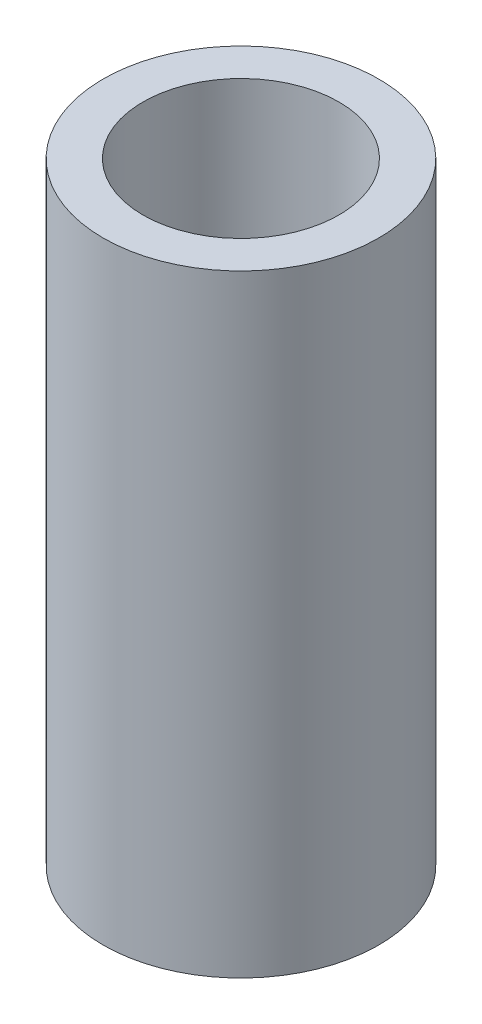
ISO-10303-21;
HEADER;
FILE_DESCRIPTION(('STEP AP214'),'2;1');
FILE_NAME('part.step','',(''),(''),'','','');
FILE_SCHEMA(('AUTOMOTIVE_DESIGN { 1 0 10303 214 1 1 1 1 }'));
ENDSEC;
DATA;
#1=APPLICATION_CONTEXT('core data for automotive mechanical design processes');
#2=APPLICATION_PROTOCOL_DEFINITION('international standard','automotive_design',2000,#1);
#3=PRODUCT_CONTEXT('',#1,'mechanical');
#4=PRODUCT('Part','Part','',(#3));
#5=PRODUCT_RELATED_PRODUCT_CATEGORY('part','',(#4));
#6=PRODUCT_DEFINITION_FORMATION('','',#4);
#7=PRODUCT_DEFINITION_CONTEXT('part definition',#1,'design');
#8=PRODUCT_DEFINITION('design','',#6,#7);
#9=PRODUCT_DEFINITION_SHAPE('','',#8);
#10=(LENGTH_UNIT() NAMED_UNIT(*) SI_UNIT(.MILLI.,.METRE.));
#11=(NAMED_UNIT(*) PLANE_ANGLE_UNIT() SI_UNIT($,.RADIAN.));
#12=(NAMED_UNIT(*) SI_UNIT($,.STERADIAN.) SOLID_ANGLE_UNIT());
#13=UNCERTAINTY_MEASURE_WITH_UNIT(LENGTH_MEASURE(1.E-05),#10,'distance_accuracy_value','');
#14=(GEOMETRIC_REPRESENTATION_CONTEXT(3) GLOBAL_UNCERTAINTY_ASSIGNED_CONTEXT((#13)) GLOBAL_UNIT_ASSIGNED_CONTEXT((#10,
#11,#12)) REPRESENTATION_CONTEXT('',''));
#15=CARTESIAN_POINT('',(0.,0.,0.));
#16=DIRECTION('',(0.,0.,1.));
#17=DIRECTION('',(1.,0.,0.));
#18=AXIS2_PLACEMENT_3D('',#15,#16,#17);
#19=CARTESIAN_POINT('',(0.,10.,0.));
#20=DIRECTION('',(0.,1.,0.));
#21=DIRECTION('',(0.,0.,1.));
#22=AXIS2_PLACEMENT_3D('',#19,#20,#21);
#23=PLANE('',#22);
#24=CARTESIAN_POINT('',(0.,10.,0.));
#25=DIRECTION('',(0.,1.,0.));
#26=DIRECTION('',(0.,0.,1.));
#27=AXIS2_PLACEMENT_3D('',#24,#25,#26);
#28=CIRCLE('',#27,2.25);
#29=CARTESIAN_POINT('',(0.,10.,2.25));
#30=VERTEX_POINT('',#29);
#31=EDGE_CURVE('E10',#30,#30,#28,.T.);
#32=ORIENTED_EDGE('',*,*,#31,.T.);
#33=EDGE_LOOP('',(#32));
#34=FACE_BOUND('',#33,.T.);
#35=CARTESIAN_POINT('',(0.,10.,0.));
#36=DIRECTION('',(0.,1.,0.));
#37=DIRECTION('',(0.,0.,1.));
#38=AXIS2_PLACEMENT_3D('',#35,#36,#37);
#39=CIRCLE('',#38,1.6);
#40=CARTESIAN_POINT('',(0.,10.,1.6));
#41=VERTEX_POINT('',#40);
#42=EDGE_CURVE('E42',#41,#41,#39,.T.);
#43=ORIENTED_EDGE('',*,*,#42,.F.);
#44=EDGE_LOOP('',(#43));
#45=FACE_BOUND('',#44,.T.);
#46=ADVANCED_FACE('F31',(#34,#45),#23,.T.);
#47=CARTESIAN_POINT('',(0.,0.,0.));
#48=DIRECTION('',(0.,1.,0.));
#49=DIRECTION('',(0.,0.,1.));
#50=AXIS2_PLACEMENT_3D('',#47,#48,#49);
#51=PLANE('',#50);
#52=CARTESIAN_POINT('',(0.,0.,0.));
#53=DIRECTION('',(0.,1.,0.));
#54=DIRECTION('',(0.,0.,1.));
#55=AXIS2_PLACEMENT_3D('',#52,#53,#54);
#56=CIRCLE('',#55,2.25);
#57=CARTESIAN_POINT('',(0.,0.,2.25));
#58=VERTEX_POINT('',#57);
#59=EDGE_CURVE('E35',#58,#58,#56,.T.);
#60=ORIENTED_EDGE('',*,*,#59,.F.);
#61=EDGE_LOOP('',(#60));
#62=FACE_BOUND('',#61,.T.);
#63=CARTESIAN_POINT('',(0.,0.,0.));
#64=DIRECTION('',(0.,1.,0.));
#65=DIRECTION('',(0.,0.,1.));
#66=AXIS2_PLACEMENT_3D('',#63,#64,#65);
#67=CIRCLE('',#66,1.6);
#68=CARTESIAN_POINT('',(0.,0.,1.6));
#69=VERTEX_POINT('',#68);
#70=EDGE_CURVE('E44',#69,#69,#67,.T.);
#71=ORIENTED_EDGE('',*,*,#70,.T.);
#72=EDGE_LOOP('',(#71));
#73=FACE_BOUND('',#72,.T.);
#74=ADVANCED_FACE('F54',(#62,#73),#51,.F.);
#75=CARTESIAN_POINT('',(0.,10.,0.));
#76=DIRECTION('',(0.,-1.,0.));
#77=DIRECTION('',(0.,0.,-1.));
#78=AXIS2_PLACEMENT_3D('',#75,#76,#77);
#79=CYLINDRICAL_SURFACE('',#78,2.25);
#80=ORIENTED_EDGE('',*,*,#31,.F.);
#81=EDGE_LOOP('',(#80));
#82=FACE_BOUND('',#81,.T.);
#83=ORIENTED_EDGE('',*,*,#59,.T.);
#84=EDGE_LOOP('',(#83));
#85=FACE_BOUND('',#84,.T.);
#86=ADVANCED_FACE('F33',(#82,#85),#79,.T.);
#87=CARTESIAN_POINT('',(0.,10.,0.));
#88=DIRECTION('',(0.,-1.,0.));
#89=DIRECTION('',(0.,0.,-1.));
#90=AXIS2_PLACEMENT_3D('',#87,#88,#89);
#91=CYLINDRICAL_SURFACE('',#90,1.6);
#92=ORIENTED_EDGE('',*,*,#42,.T.);
#93=EDGE_LOOP('',(#92));
#94=FACE_BOUND('',#93,.T.);
#95=ORIENTED_EDGE('',*,*,#70,.F.);
#96=EDGE_LOOP('',(#95));
#97=FACE_BOUND('',#96,.T.);
#98=ADVANCED_FACE('F50',(#94,#97),#91,.F.);
#99=CLOSED_SHELL('',(#46,#74,#86,#98));
#100=MANIFOLD_SOLID_BREP('B2',#99);
#101=ADVANCED_BREP_SHAPE_REPRESENTATION('',(#18,#100),#14);
#102=SHAPE_DEFINITION_REPRESENTATION(#9,#101);
ENDSEC;
END-ISO-10303-21;
